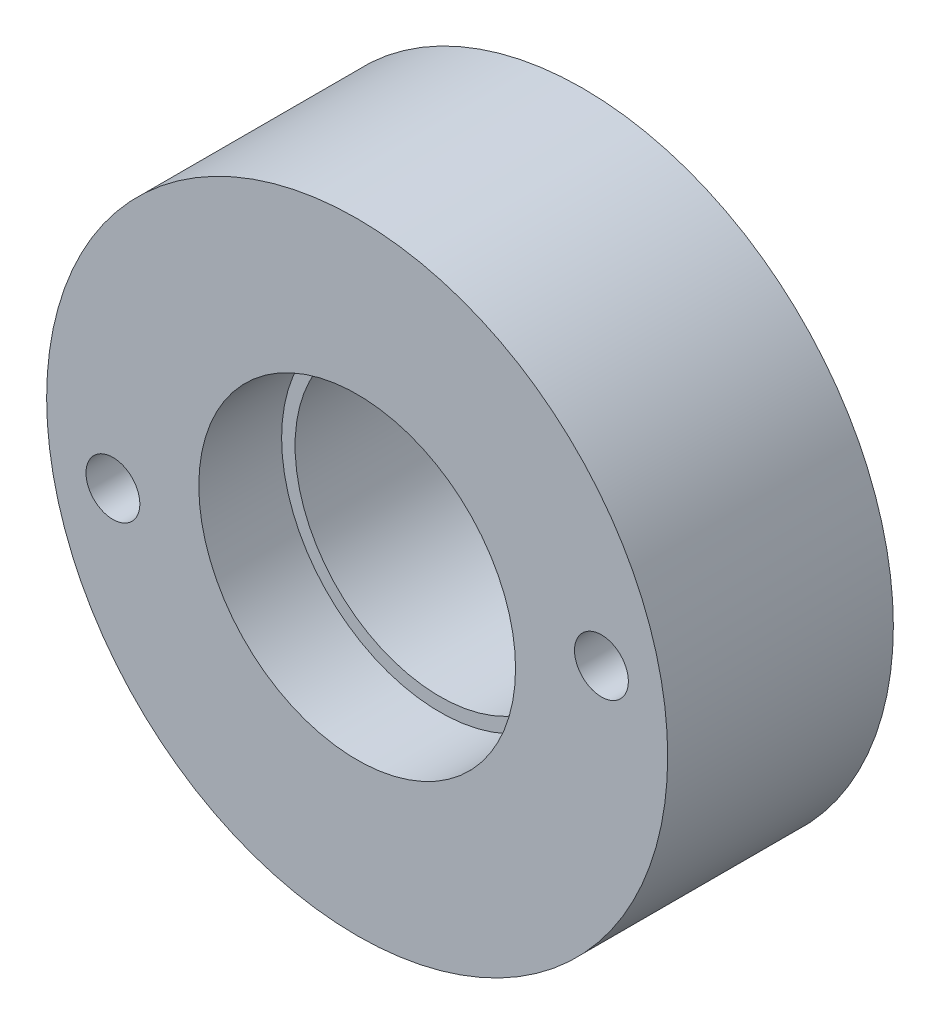
ISO-10303-21;
HEADER;
FILE_DESCRIPTION(('STEP AP214'),'2;1');
FILE_NAME('part.step','',(''),(''),'','','');
FILE_SCHEMA(('AUTOMOTIVE_DESIGN { 1 0 10303 214 1 1 1 1 }'));
ENDSEC;
DATA;
#1=APPLICATION_CONTEXT('core data for automotive mechanical design processes');
#2=APPLICATION_PROTOCOL_DEFINITION('international standard','automotive_design',2000,#1);
#3=PRODUCT_CONTEXT('',#1,'mechanical');
#4=PRODUCT('Part','Part','',(#3));
#5=PRODUCT_RELATED_PRODUCT_CATEGORY('part','',(#4));
#6=PRODUCT_DEFINITION_FORMATION('','',#4);
#7=PRODUCT_DEFINITION_CONTEXT('part definition',#1,'design');
#8=PRODUCT_DEFINITION('design','',#6,#7);
#9=PRODUCT_DEFINITION_SHAPE('','',#8);
#10=(LENGTH_UNIT() NAMED_UNIT(*) SI_UNIT(.MILLI.,.METRE.));
#11=(NAMED_UNIT(*) PLANE_ANGLE_UNIT() SI_UNIT($,.RADIAN.));
#12=(NAMED_UNIT(*) SI_UNIT($,.STERADIAN.) SOLID_ANGLE_UNIT());
#13=UNCERTAINTY_MEASURE_WITH_UNIT(LENGTH_MEASURE(1.E-05),#10,'distance_accuracy_value','');
#14=(GEOMETRIC_REPRESENTATION_CONTEXT(3) GLOBAL_UNCERTAINTY_ASSIGNED_CONTEXT((#13)) GLOBAL_UNIT_ASSIGNED_CONTEXT((#10,
#11,#12)) REPRESENTATION_CONTEXT('',''));
#15=CARTESIAN_POINT('',(0.,0.,0.));
#16=DIRECTION('',(0.,0.,1.));
#17=DIRECTION('',(1.,0.,0.));
#18=AXIS2_PLACEMENT_3D('',#15,#16,#17);
#19=CARTESIAN_POINT('',(0.,0.,10.9));
#20=DIRECTION('',(0.,0.,-1.));
#21=DIRECTION('',(-1.,0.,0.));
#22=AXIS2_PLACEMENT_3D('',#19,#20,#21);
#23=CYLINDRICAL_SURFACE('',#22,7.);
#24=CARTESIAN_POINT('',(0.,0.,0.));
#25=DIRECTION('',(0.,0.,1.));
#26=DIRECTION('',(1.,0.,0.));
#27=AXIS2_PLACEMENT_3D('',#24,#25,#26);
#28=CIRCLE('',#27,7.);
#29=CARTESIAN_POINT('',(7.,0.,0.));
#30=VERTEX_POINT('',#29);
#31=EDGE_CURVE('E49',#30,#30,#28,.T.);
#32=ORIENTED_EDGE('',*,*,#31,.F.);
#33=EDGE_LOOP('',(#32));
#34=FACE_BOUND('',#33,.T.);
#35=CARTESIAN_POINT('',(0.,0.,6.9));
#36=DIRECTION('',(0.,0.,1.));
#37=DIRECTION('',(1.,0.,0.));
#38=AXIS2_PLACEMENT_3D('',#35,#36,#37);
#39=CIRCLE('',#38,7.);
#40=CARTESIAN_POINT('',(7.,0.,6.9));
#41=VERTEX_POINT('',#40);
#42=EDGE_CURVE('E40',#41,#41,#39,.T.);
#43=ORIENTED_EDGE('',*,*,#42,.T.);
#44=EDGE_LOOP('',(#43));
#45=FACE_BOUND('',#44,.T.);
#46=ADVANCED_FACE('F36',(#34,#45),#23,.F.);
#47=CARTESIAN_POINT('',(0.,0.,10.9));
#48=DIRECTION('',(0.,0.,1.));
#49=DIRECTION('',(1.,0.,0.));
#50=AXIS2_PLACEMENT_3D('',#47,#48,#49);
#51=PLANE('',#50);
#52=CARTESIAN_POINT('',(11.7988302074375,2.18805981088374,10.9));
#53=DIRECTION('',(0.,0.,-1.));
#54=DIRECTION('',(-1.,0.,0.));
#55=AXIS2_PLACEMENT_3D('',#52,#53,#54);
#56=CIRCLE('',#55,1.3);
#57=CARTESIAN_POINT('',(10.4988302074375,2.18805981088374,10.9));
#58=VERTEX_POINT('',#57);
#59=EDGE_CURVE('E57',#58,#58,#56,.T.);
#60=ORIENTED_EDGE('',*,*,#59,.T.);
#61=EDGE_LOOP('',(#60));
#62=FACE_BOUND('',#61,.T.);
#63=CARTESIAN_POINT('',(-11.798830207442,-2.18805981088485,10.9));
#64=DIRECTION('',(0.,0.,-1.));
#65=DIRECTION('',(-1.,0.,0.));
#66=AXIS2_PLACEMENT_3D('',#63,#64,#65);
#67=CIRCLE('',#66,1.3);
#68=CARTESIAN_POINT('',(-13.098830207442,-2.18805981088485,10.9));
#69=VERTEX_POINT('',#68);
#70=EDGE_CURVE('E63',#69,#69,#67,.T.);
#71=ORIENTED_EDGE('',*,*,#70,.T.);
#72=EDGE_LOOP('',(#71));
#73=FACE_BOUND('',#72,.T.);
#74=CARTESIAN_POINT('',(0.,0.,10.9));
#75=DIRECTION('',(0.,0.,1.));
#76=DIRECTION('',(1.,0.,0.));
#77=AXIS2_PLACEMENT_3D('',#74,#75,#76);
#78=CIRCLE('',#77,7.65);
#79=CARTESIAN_POINT('',(7.65,0.,10.9));
#80=VERTEX_POINT('',#79);
#81=EDGE_CURVE('E53',#80,#80,#78,.T.);
#82=ORIENTED_EDGE('',*,*,#81,.F.);
#83=EDGE_LOOP('',(#82));
#84=FACE_BOUND('',#83,.T.);
#85=CARTESIAN_POINT('',(0.,0.,10.9));
#86=DIRECTION('',(0.,0.,1.));
#87=DIRECTION('',(1.,0.,0.));
#88=AXIS2_PLACEMENT_3D('',#85,#86,#87);
#89=CIRCLE('',#88,15.);
#90=CARTESIAN_POINT('',(15.,0.,10.9));
#91=VERTEX_POINT('',#90);
#92=EDGE_CURVE('E10',#91,#91,#89,.T.);
#93=ORIENTED_EDGE('',*,*,#92,.T.);
#94=EDGE_LOOP('',(#93));
#95=FACE_BOUND('',#94,.T.);
#96=ADVANCED_FACE('F72',(#62,#73,#84,#95),#51,.T.);
#97=CARTESIAN_POINT('',(0.,0.,0.));
#98=DIRECTION('',(0.,0.,1.));
#99=DIRECTION('',(1.,0.,0.));
#100=AXIS2_PLACEMENT_3D('',#97,#98,#99);
#101=PLANE('',#100);
#102=CARTESIAN_POINT('',(11.7988302074375,2.18805981088374,0.));
#103=DIRECTION('',(0.,0.,-1.));
#104=DIRECTION('',(-1.,0.,0.));
#105=AXIS2_PLACEMENT_3D('',#102,#103,#104);
#106=CIRCLE('',#105,1.3);
#107=CARTESIAN_POINT('',(10.4988302074375,2.18805981088374,0.));
#108=VERTEX_POINT('',#107);
#109=EDGE_CURVE('E66',#108,#108,#106,.T.);
#110=ORIENTED_EDGE('',*,*,#109,.F.);
#111=EDGE_LOOP('',(#110));
#112=FACE_BOUND('',#111,.T.);
#113=CARTESIAN_POINT('',(-11.798830207442,-2.18805981088485,0.));
#114=DIRECTION('',(0.,0.,-1.));
#115=DIRECTION('',(-1.,0.,0.));
#116=AXIS2_PLACEMENT_3D('',#113,#114,#115);
#117=CIRCLE('',#116,1.3);
#118=CARTESIAN_POINT('',(-13.098830207442,-2.18805981088485,0.));
#119=VERTEX_POINT('',#118);
#120=EDGE_CURVE('E60',#119,#119,#117,.T.);
#121=ORIENTED_EDGE('',*,*,#120,.F.);
#122=EDGE_LOOP('',(#121));
#123=FACE_BOUND('',#122,.T.);
#124=CARTESIAN_POINT('',(0.,0.,0.));
#125=DIRECTION('',(0.,0.,1.));
#126=DIRECTION('',(1.,0.,0.));
#127=AXIS2_PLACEMENT_3D('',#124,#125,#126);
#128=CIRCLE('',#127,15.);
#129=CARTESIAN_POINT('',(15.,0.,0.));
#130=VERTEX_POINT('',#129);
#131=EDGE_CURVE('E44',#130,#130,#128,.T.);
#132=ORIENTED_EDGE('',*,*,#131,.F.);
#133=EDGE_LOOP('',(#132));
#134=FACE_BOUND('',#133,.T.);
#135=ORIENTED_EDGE('',*,*,#31,.T.);
#136=EDGE_LOOP('',(#135));
#137=FACE_BOUND('',#136,.T.);
#138=ADVANCED_FACE('F82',(#112,#123,#134,#137),#101,.F.);
#139=CARTESIAN_POINT('',(0.,0.,10.9));
#140=DIRECTION('',(0.,0.,-1.));
#141=DIRECTION('',(-1.,0.,0.));
#142=AXIS2_PLACEMENT_3D('',#139,#140,#141);
#143=CYLINDRICAL_SURFACE('',#142,15.);
#144=ORIENTED_EDGE('',*,*,#92,.F.);
#145=EDGE_LOOP('',(#144));
#146=FACE_BOUND('',#145,.T.);
#147=ORIENTED_EDGE('',*,*,#131,.T.);
#148=EDGE_LOOP('',(#147));
#149=FACE_BOUND('',#148,.T.);
#150=ADVANCED_FACE('F38',(#146,#149),#143,.T.);
#151=CARTESIAN_POINT('',(0.,0.,6.9));
#152=DIRECTION('',(0.,0.,1.));
#153=DIRECTION('',(1.,0.,0.));
#154=AXIS2_PLACEMENT_3D('',#151,#152,#153);
#155=CYLINDRICAL_SURFACE('',#154,7.65);
#156=CARTESIAN_POINT('',(0.,0.,6.9));
#157=DIRECTION('',(0.,0.,1.));
#158=DIRECTION('',(1.,0.,0.));
#159=AXIS2_PLACEMENT_3D('',#156,#157,#158);
#160=CIRCLE('',#159,7.65);
#161=CARTESIAN_POINT('',(7.65,0.,6.9));
#162=VERTEX_POINT('',#161);
#163=EDGE_CURVE('E56',#162,#162,#160,.T.);
#164=ORIENTED_EDGE('',*,*,#163,.F.);
#165=EDGE_LOOP('',(#164));
#166=FACE_BOUND('',#165,.T.);
#167=ORIENTED_EDGE('',*,*,#81,.T.);
#168=EDGE_LOOP('',(#167));
#169=FACE_BOUND('',#168,.T.);
#170=ADVANCED_FACE('F100',(#166,#169),#155,.F.);
#171=CARTESIAN_POINT('',(0.,0.,6.9));
#172=DIRECTION('',(0.,0.,1.));
#173=DIRECTION('',(1.,0.,0.));
#174=AXIS2_PLACEMENT_3D('',#171,#172,#173);
#175=PLANE('',#174);
#176=ORIENTED_EDGE('',*,*,#42,.F.);
#177=EDGE_LOOP('',(#176));
#178=FACE_BOUND('',#177,.T.);
#179=ORIENTED_EDGE('',*,*,#163,.T.);
#180=EDGE_LOOP('',(#179));
#181=FACE_BOUND('',#180,.T.);
#182=ADVANCED_FACE('F97',(#178,#181),#175,.T.);
#183=CARTESIAN_POINT('',(-11.798830207442,-2.18805981088485,10.9));
#184=DIRECTION('',(0.,0.,-1.));
#185=DIRECTION('',(-1.,0.,0.));
#186=AXIS2_PLACEMENT_3D('',#183,#184,#185);
#187=CYLINDRICAL_SURFACE('',#186,1.3);
#188=ORIENTED_EDGE('',*,*,#70,.F.);
#189=EDGE_LOOP('',(#188));
#190=FACE_BOUND('',#189,.T.);
#191=ORIENTED_EDGE('',*,*,#120,.T.);
#192=EDGE_LOOP('',(#191));
#193=FACE_BOUND('',#192,.T.);
#194=ADVANCED_FACE('F78',(#190,#193),#187,.F.);
#195=CARTESIAN_POINT('',(11.7988302074375,2.18805981088374,10.9));
#196=DIRECTION('',(0.,0.,-1.));
#197=DIRECTION('',(-1.,0.,0.));
#198=AXIS2_PLACEMENT_3D('',#195,#196,#197);
#199=CYLINDRICAL_SURFACE('',#198,1.3);
#200=ORIENTED_EDGE('',*,*,#59,.F.);
#201=EDGE_LOOP('',(#200));
#202=FACE_BOUND('',#201,.T.);
#203=ORIENTED_EDGE('',*,*,#109,.T.);
#204=EDGE_LOOP('',(#203));
#205=FACE_BOUND('',#204,.T.);
#206=ADVANCED_FACE('F75',(#202,#205),#199,.F.);
#207=CLOSED_SHELL('',(#46,#96,#138,#150,#170,#182,#194,#206));
#208=MANIFOLD_SOLID_BREP('B2',#207);
#209=ADVANCED_BREP_SHAPE_REPRESENTATION('',(#18,#208),#14);
#210=SHAPE_DEFINITION_REPRESENTATION(#9,#209);
ENDSEC;
END-ISO-10303-21;
